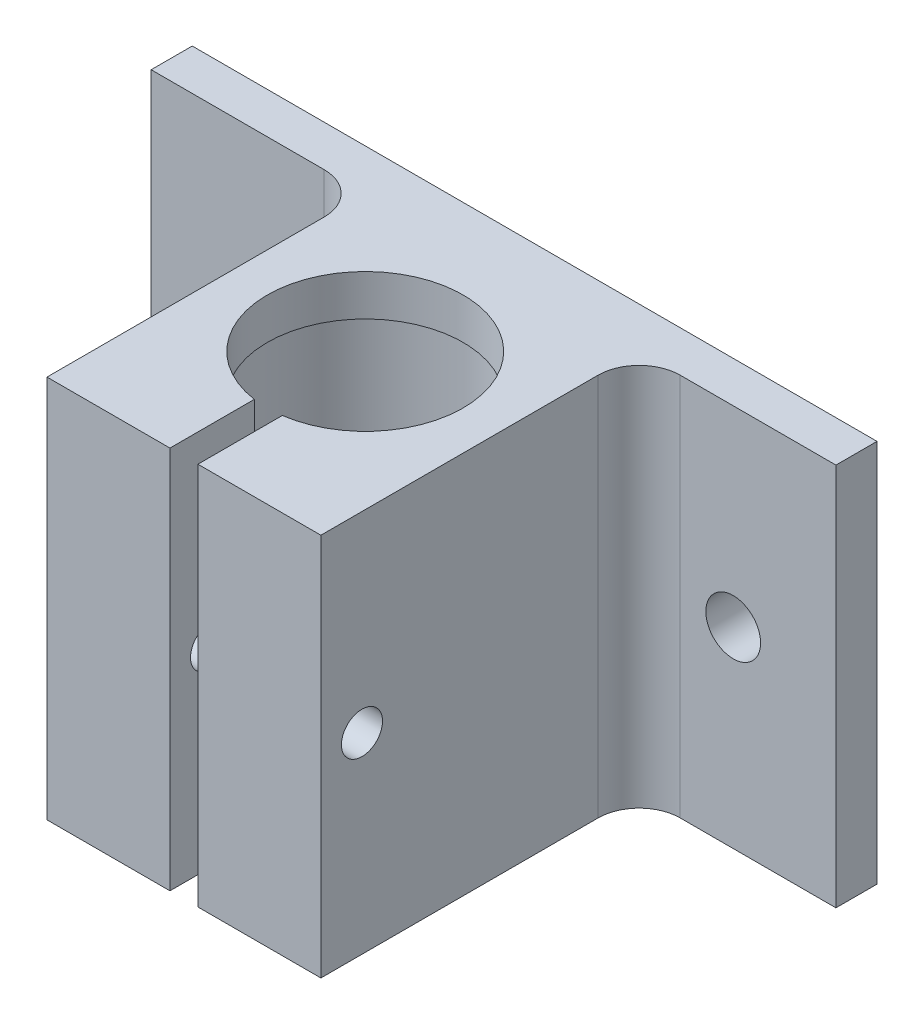
ISO-10303-21;
HEADER;
FILE_DESCRIPTION(('STEP AP214'),'2;1');
FILE_NAME('part.step','',(''),(''),'','','');
FILE_SCHEMA(('AUTOMOTIVE_DESIGN { 1 0 10303 214 1 1 1 1 }'));
ENDSEC;
DATA;
#1=APPLICATION_CONTEXT('core data for automotive mechanical design processes');
#2=APPLICATION_PROTOCOL_DEFINITION('international standard','automotive_design',2000,#1);
#3=PRODUCT_CONTEXT('',#1,'mechanical');
#4=PRODUCT('Part','Part','',(#3));
#5=PRODUCT_RELATED_PRODUCT_CATEGORY('part','',(#4));
#6=PRODUCT_DEFINITION_FORMATION('','',#4);
#7=PRODUCT_DEFINITION_CONTEXT('part definition',#1,'design');
#8=PRODUCT_DEFINITION('design','',#6,#7);
#9=PRODUCT_DEFINITION_SHAPE('','',#8);
#10=(LENGTH_UNIT() NAMED_UNIT(*) SI_UNIT(.MILLI.,.METRE.));
#11=(NAMED_UNIT(*) PLANE_ANGLE_UNIT() SI_UNIT($,.RADIAN.));
#12=(NAMED_UNIT(*) SI_UNIT($,.STERADIAN.) SOLID_ANGLE_UNIT());
#13=UNCERTAINTY_MEASURE_WITH_UNIT(LENGTH_MEASURE(1.E-05),#10,'distance_accuracy_value','');
#14=(GEOMETRIC_REPRESENTATION_CONTEXT(3) GLOBAL_UNCERTAINTY_ASSIGNED_CONTEXT((#13)) GLOBAL_UNIT_ASSIGNED_CONTEXT((#10,
#11,#12)) REPRESENTATION_CONTEXT('',''));
#15=CARTESIAN_POINT('',(0.,0.,0.));
#16=DIRECTION('',(0.,0.,1.));
#17=DIRECTION('',(1.,0.,0.));
#18=AXIS2_PLACEMENT_3D('',#15,#16,#17);
#19=CARTESIAN_POINT('',(0.,28.,0.));
#20=DIRECTION('',(0.,-1.,0.));
#21=DIRECTION('',(0.,0.,-1.));
#22=AXIS2_PLACEMENT_3D('',#19,#20,#21);
#23=CYLINDRICAL_SURFACE('',#22,7.15);
#24=CARTESIAN_POINT('',(0.,25.,0.));
#25=DIRECTION('',(0.,-1.,0.));
#26=DIRECTION('',(0.,0.,-1.));
#27=AXIS2_PLACEMENT_3D('',#24,#25,#26);
#28=CIRCLE('',#27,7.15);
#29=CARTESIAN_POINT('',(1.02142857142857,25.,7.07666472806713));
#30=VERTEX_POINT('',#29);
#31=CARTESIAN_POINT('',(-1.02142857142857,25.,7.07666472806713));
#32=VERTEX_POINT('',#31);
#33=EDGE_CURVE('E711',#30,#32,#28,.F.);
#34=ORIENTED_EDGE('',*,*,#33,.F.);
#35=DIRECTION('',(0.,-1.,0.));
#36=VECTOR('',#35,1.);
#37=CARTESIAN_POINT('',(1.02142857142857,28.,7.07666472806713));
#38=LINE('',#37,#36);
#39=CARTESIAN_POINT('',(1.02142857142857,28.,7.07666472806713));
#40=VERTEX_POINT('',#39);
#41=EDGE_CURVE('E201',#40,#30,#38,.T.);
#42=ORIENTED_EDGE('',*,*,#41,.F.);
#43=CARTESIAN_POINT('',(0.,28.,0.));
#44=DIRECTION('',(0.,-1.,0.));
#45=DIRECTION('',(0.,0.,1.));
#46=AXIS2_PLACEMENT_3D('',#43,#44,#45);
#47=CIRCLE('',#46,7.15);
#48=CARTESIAN_POINT('',(-1.02142857142857,28.,7.07666472806713));
#49=VERTEX_POINT('',#48);
#50=EDGE_CURVE('E333',#49,#40,#47,.T.);
#51=ORIENTED_EDGE('',*,*,#50,.F.);
#52=DIRECTION('',(0.,-1.,0.));
#53=VECTOR('',#52,1.);
#54=CARTESIAN_POINT('',(-1.02142857142857,28.,7.07666472806713));
#55=LINE('',#54,#53);
#56=EDGE_CURVE('E206',#49,#32,#55,.T.);
#57=ORIENTED_EDGE('',*,*,#56,.T.);
#58=EDGE_LOOP('',(#34,#42,#51,#57));
#59=FACE_BOUND('',#58,.T.);
#60=ADVANCED_FACE('F34',(#59),#23,.F.);
#61=CARTESIAN_POINT('',(10.,14.,10.2380490068163));
#62=DIRECTION('',(-1.,0.,0.));
#63=DIRECTION('',(0.,0.,1.));
#64=AXIS2_PLACEMENT_3D('',#61,#62,#63);
#65=CYLINDRICAL_SURFACE('',#64,1.5);
#66=CARTESIAN_POINT('',(-1.02142857142857,14.,10.2380490068163));
#67=DIRECTION('',(-1.,0.,0.));
#68=DIRECTION('',(0.,0.,1.));
#69=AXIS2_PLACEMENT_3D('',#66,#67,#68);
#70=CIRCLE('',#69,1.5);
#71=CARTESIAN_POINT('',(-1.02142857142857,14.,11.7380490068163));
#72=VERTEX_POINT('',#71);
#73=EDGE_CURVE('E315',#72,#72,#70,.T.);
#74=ORIENTED_EDGE('',*,*,#73,.F.);
#75=EDGE_LOOP('',(#74));
#76=FACE_BOUND('',#75,.T.);
#77=CARTESIAN_POINT('',(-8.,14.,10.2380490068163));
#78=DIRECTION('',(-1.,0.,0.));
#79=DIRECTION('',(0.,0.,1.));
#80=AXIS2_PLACEMENT_3D('',#77,#78,#79);
#81=CIRCLE('',#80,1.5);
#82=CARTESIAN_POINT('',(-8.,14.,11.7380490068163));
#83=VERTEX_POINT('',#82);
#84=EDGE_CURVE('E232',#83,#83,#81,.F.);
#85=ORIENTED_EDGE('',*,*,#84,.F.);
#86=EDGE_LOOP('',(#85));
#87=FACE_BOUND('',#86,.T.);
#88=ADVANCED_FACE('F353',(#76,#87),#65,.F.);
#89=CARTESIAN_POINT('',(24.3688826027197,28.,-10.));
#90=DIRECTION('',(-1.,0.,0.));
#91=DIRECTION('',(0.,0.,1.));
#92=AXIS2_PLACEMENT_3D('',#89,#90,#91);
#93=PLANE('',#92);
#94=DIRECTION('',(0.,0.,-1.));
#95=VECTOR('',#94,1.);
#96=CARTESIAN_POINT('',(24.3688826027197,0.,-10.));
#97=LINE('',#96,#95);
#98=CARTESIAN_POINT('',(24.3688826027197,0.,-10.));
#99=VERTEX_POINT('',#98);
#100=CARTESIAN_POINT('',(24.3688826027197,0.,-13.));
#101=VERTEX_POINT('',#100);
#102=EDGE_CURVE('E311',#99,#101,#97,.T.);
#103=ORIENTED_EDGE('',*,*,#102,.T.);
#104=DIRECTION('',(0.,-1.,0.));
#105=VECTOR('',#104,1.);
#106=CARTESIAN_POINT('',(24.3688826027197,28.,-13.));
#107=LINE('',#106,#105);
#108=CARTESIAN_POINT('',(24.3688826027197,28.,-13.));
#109=VERTEX_POINT('',#108);
#110=EDGE_CURVE('E228',#109,#101,#107,.T.);
#111=ORIENTED_EDGE('',*,*,#110,.F.);
#112=DIRECTION('',(0.,0.,-1.));
#113=VECTOR('',#112,1.);
#114=CARTESIAN_POINT('',(24.3688826027197,28.,-10.));
#115=LINE('',#114,#113);
#116=CARTESIAN_POINT('',(24.3688826027197,28.,-10.));
#117=VERTEX_POINT('',#116);
#118=EDGE_CURVE('E278',#117,#109,#115,.T.);
#119=ORIENTED_EDGE('',*,*,#118,.F.);
#120=DIRECTION('',(0.,-1.,0.));
#121=VECTOR('',#120,1.);
#122=CARTESIAN_POINT('',(24.3688826027197,28.,-10.));
#123=LINE('',#122,#121);
#124=EDGE_CURVE('E279',#117,#99,#123,.T.);
#125=ORIENTED_EDGE('',*,*,#124,.T.);
#126=EDGE_LOOP('',(#103,#111,#119,#125));
#127=FACE_BOUND('',#126,.T.);
#128=ADVANCED_FACE('F358',(#127),#93,.F.);
#129=CARTESIAN_POINT('',(-25.6311173972803,28.,-13.));
#130=DIRECTION('',(0.,0.,1.));
#131=DIRECTION('',(1.,0.,0.));
#132=AXIS2_PLACEMENT_3D('',#129,#130,#131);
#133=PLANE('',#132);
#134=CARTESIAN_POINT('',(16.8688826027197,14.,-13.));
#135=DIRECTION('',(0.,0.,-1.));
#136=DIRECTION('',(-1.,0.,0.));
#137=AXIS2_PLACEMENT_3D('',#134,#135,#136);
#138=CIRCLE('',#137,2.);
#139=CARTESIAN_POINT('',(14.8688826027197,14.,-13.));
#140=VERTEX_POINT('',#139);
#141=EDGE_CURVE('E444',#140,#140,#138,.T.);
#142=ORIENTED_EDGE('',*,*,#141,.F.);
#143=EDGE_LOOP('',(#142));
#144=FACE_BOUND('',#143,.T.);
#145=CARTESIAN_POINT('',(-16.8688826027197,14.,-13.));
#146=DIRECTION('',(0.,0.,-1.));
#147=DIRECTION('',(1.,0.,0.));
#148=AXIS2_PLACEMENT_3D('',#145,#146,#147);
#149=CIRCLE('',#148,2.);
#150=CARTESIAN_POINT('',(-14.8688826027197,14.,-13.));
#151=VERTEX_POINT('',#150);
#152=EDGE_CURVE('E456',#151,#151,#149,.T.);
#153=ORIENTED_EDGE('',*,*,#152,.F.);
#154=EDGE_LOOP('',(#153));
#155=FACE_BOUND('',#154,.T.);
#156=DIRECTION('',(-1.,0.,0.));
#157=VECTOR('',#156,1.);
#158=CARTESIAN_POINT('',(-25.6311173972803,0.,-13.));
#159=LINE('',#158,#157);
#160=CARTESIAN_POINT('',(-25.6311173972803,0.,-13.));
#161=VERTEX_POINT('',#160);
#162=EDGE_CURVE('E314',#101,#161,#159,.T.);
#163=ORIENTED_EDGE('',*,*,#162,.T.);
#164=DIRECTION('',(0.,-1.,0.));
#165=VECTOR('',#164,1.);
#166=CARTESIAN_POINT('',(-25.6311173972803,28.,-13.));
#167=LINE('',#166,#165);
#168=CARTESIAN_POINT('',(-25.6311173972803,28.,-13.));
#169=VERTEX_POINT('',#168);
#170=EDGE_CURVE('E225',#169,#161,#167,.T.);
#171=ORIENTED_EDGE('',*,*,#170,.F.);
#172=DIRECTION('',(-1.,0.,0.));
#173=VECTOR('',#172,1.);
#174=CARTESIAN_POINT('',(-25.6311173972803,28.,-13.));
#175=LINE('',#174,#173);
#176=EDGE_CURVE('E511',#109,#169,#175,.T.);
#177=ORIENTED_EDGE('',*,*,#176,.F.);
#178=ORIENTED_EDGE('',*,*,#110,.T.);
#179=EDGE_LOOP('',(#163,#171,#177,#178));
#180=FACE_BOUND('',#179,.T.);
#181=ADVANCED_FACE('F378',(#144,#155,#180),#133,.F.);
#182=CARTESIAN_POINT('',(-25.6311173972803,28.,-10.));
#183=DIRECTION('',(1.,0.,0.));
#184=DIRECTION('',(0.,0.,-1.));
#185=AXIS2_PLACEMENT_3D('',#182,#183,#184);
#186=PLANE('',#185);
#187=DIRECTION('',(0.,0.,1.));
#188=VECTOR('',#187,1.);
#189=CARTESIAN_POINT('',(-25.6311173972803,0.,-10.));
#190=LINE('',#189,#188);
#191=CARTESIAN_POINT('',(-25.6311173972803,0.,-10.));
#192=VERTEX_POINT('',#191);
#193=EDGE_CURVE('E317',#161,#192,#190,.T.);
#194=ORIENTED_EDGE('',*,*,#193,.T.);
#195=DIRECTION('',(0.,-1.,0.));
#196=VECTOR('',#195,1.);
#197=CARTESIAN_POINT('',(-25.6311173972803,28.,-10.));
#198=LINE('',#197,#196);
#199=CARTESIAN_POINT('',(-25.6311173972803,28.,-10.));
#200=VERTEX_POINT('',#199);
#201=EDGE_CURVE('E222',#200,#192,#198,.T.);
#202=ORIENTED_EDGE('',*,*,#201,.F.);
#203=DIRECTION('',(0.,0.,1.));
#204=VECTOR('',#203,1.);
#205=CARTESIAN_POINT('',(-25.6311173972803,28.,-10.));
#206=LINE('',#205,#204);
#207=EDGE_CURVE('E513',#169,#200,#206,.T.);
#208=ORIENTED_EDGE('',*,*,#207,.F.);
#209=ORIENTED_EDGE('',*,*,#170,.T.);
#210=EDGE_LOOP('',(#194,#202,#208,#209));
#211=FACE_BOUND('',#210,.T.);
#212=ADVANCED_FACE('F374',(#211),#186,.F.);
#213=CARTESIAN_POINT('',(-25.6311173972803,28.,-10.));
#214=DIRECTION('',(0.,0.,-1.));
#215=DIRECTION('',(-1.,0.,0.));
#216=AXIS2_PLACEMENT_3D('',#213,#214,#215);
#217=PLANE('',#216);
#218=CARTESIAN_POINT('',(-16.8688826027197,14.,-10.));
#219=DIRECTION('',(0.,0.,-1.));
#220=DIRECTION('',(1.,0.,0.));
#221=AXIS2_PLACEMENT_3D('',#218,#219,#220);
#222=CIRCLE('',#221,2.);
#223=CARTESIAN_POINT('',(-14.8688826027197,14.,-10.));
#224=VERTEX_POINT('',#223);
#225=EDGE_CURVE('E449',#224,#224,#222,.T.);
#226=ORIENTED_EDGE('',*,*,#225,.T.);
#227=EDGE_LOOP('',(#226));
#228=FACE_BOUND('',#227,.T.);
#229=DIRECTION('',(1.,0.,0.));
#230=VECTOR('',#229,1.);
#231=CARTESIAN_POINT('',(-25.6311173972803,0.,-10.));
#232=LINE('',#231,#230);
#233=CARTESIAN_POINT('',(-13.,0.,-10.));
#234=VERTEX_POINT('',#233);
#235=EDGE_CURVE('E319',#192,#234,#232,.T.);
#236=ORIENTED_EDGE('',*,*,#235,.T.);
#237=DIRECTION('',(0.,-1.,0.));
#238=VECTOR('',#237,1.);
#239=CARTESIAN_POINT('',(-13.,28.,-10.));
#240=LINE('',#239,#238);
#241=CARTESIAN_POINT('',(-13.,28.,-10.));
#242=VERTEX_POINT('',#241);
#243=EDGE_CURVE('E57',#234,#242,#240,.F.);
#244=ORIENTED_EDGE('',*,*,#243,.T.);
#245=DIRECTION('',(1.,0.,0.));
#246=VECTOR('',#245,1.);
#247=CARTESIAN_POINT('',(-25.6311173972803,28.,-10.));
#248=LINE('',#247,#246);
#249=EDGE_CURVE('E335',#200,#242,#248,.T.);
#250=ORIENTED_EDGE('',*,*,#249,.F.);
#251=ORIENTED_EDGE('',*,*,#201,.T.);
#252=EDGE_LOOP('',(#236,#244,#250,#251));
#253=FACE_BOUND('',#252,.T.);
#254=ADVANCED_FACE('F370',(#228,#253),#217,.F.);
#255=CARTESIAN_POINT('',(-10.,28.,-10.));
#256=DIRECTION('',(1.,0.,0.));
#257=DIRECTION('',(0.,0.,-1.));
#258=AXIS2_PLACEMENT_3D('',#255,#256,#257);
#259=PLANE('',#258);
#260=DIRECTION('',(0.,-0.500000000000001,-0.866025403784438));
#261=VECTOR('',#260,1.);
#262=CARTESIAN_POINT('',(-10.,17.1754264805429,10.2380490068163));
#263=LINE('',#262,#261);
#264=CARTESIAN_POINT('',(-10.,17.1754264805429,10.2380490068163));
#265=VERTEX_POINT('',#264);
#266=CARTESIAN_POINT('',(-10.,15.5877132402715,7.4880490068163));
#267=VERTEX_POINT('',#266);
#268=EDGE_CURVE('E446',#265,#267,#263,.T.);
#269=ORIENTED_EDGE('',*,*,#268,.F.);
#270=DIRECTION('',(0.,0.5,-0.866025403784439));
#271=VECTOR('',#270,1.);
#272=CARTESIAN_POINT('',(-10.,15.5877132402715,12.9880490068163));
#273=LINE('',#272,#271);
#274=CARTESIAN_POINT('',(-10.,15.5877132402715,12.9880490068163));
#275=VERTEX_POINT('',#274);
#276=EDGE_CURVE('E443',#275,#265,#273,.T.);
#277=ORIENTED_EDGE('',*,*,#276,.F.);
#278=DIRECTION('',(0.,1.,0.));
#279=VECTOR('',#278,1.);
#280=CARTESIAN_POINT('',(-10.,12.4122867597285,12.9880490068163));
#281=LINE('',#280,#279);
#282=CARTESIAN_POINT('',(-10.,12.4122867597285,12.9880490068163));
#283=VERTEX_POINT('',#282);
#284=EDGE_CURVE('E463',#283,#275,#281,.T.);
#285=ORIENTED_EDGE('',*,*,#284,.F.);
#286=DIRECTION('',(0.,0.5,0.866025403784439));
#287=VECTOR('',#286,1.);
#288=CARTESIAN_POINT('',(-10.,10.8245735194571,10.2380490068163));
#289=LINE('',#288,#287);
#290=CARTESIAN_POINT('',(-10.,10.8245735194571,10.2380490068163));
#291=VERTEX_POINT('',#290);
#292=EDGE_CURVE('E487',#291,#283,#289,.T.);
#293=ORIENTED_EDGE('',*,*,#292,.F.);
#294=DIRECTION('',(0.,-0.5,0.866025403784438));
#295=VECTOR('',#294,1.);
#296=CARTESIAN_POINT('',(-10.,12.4122867597285,7.4880490068163));
#297=LINE('',#296,#295);
#298=CARTESIAN_POINT('',(-10.,12.4122867597285,7.4880490068163));
#299=VERTEX_POINT('',#298);
#300=EDGE_CURVE('E484',#299,#291,#297,.T.);
#301=ORIENTED_EDGE('',*,*,#300,.F.);
#302=DIRECTION('',(0.,-1.,0.));
#303=VECTOR('',#302,1.);
#304=CARTESIAN_POINT('',(-10.,15.5877132402715,7.4880490068163));
#305=LINE('',#304,#303);
#306=EDGE_CURVE('E481',#267,#299,#305,.T.);
#307=ORIENTED_EDGE('',*,*,#306,.F.);
#308=EDGE_LOOP('',(#269,#277,#285,#293,#301,#307));
#309=FACE_BOUND('',#308,.T.);
#310=DIRECTION('',(0.,0.,1.));
#311=VECTOR('',#310,1.);
#312=CARTESIAN_POINT('',(-10.,28.,-10.));
#313=LINE('',#312,#311);
#314=CARTESIAN_POINT('',(-10.,28.,-7.));
#315=VERTEX_POINT('',#314);
#316=CARTESIAN_POINT('',(-10.,28.,13.2380490068163));
#317=VERTEX_POINT('',#316);
#318=EDGE_CURVE('E331',#315,#317,#313,.T.);
#319=ORIENTED_EDGE('',*,*,#318,.F.);
#320=DIRECTION('',(0.,-1.,0.));
#321=VECTOR('',#320,1.);
#322=CARTESIAN_POINT('',(-10.,0.,-7.));
#323=LINE('',#322,#321);
#324=CARTESIAN_POINT('',(-10.,0.,-7.));
#325=VERTEX_POINT('',#324);
#326=EDGE_CURVE('E245',#315,#325,#323,.T.);
#327=ORIENTED_EDGE('',*,*,#326,.T.);
#328=DIRECTION('',(0.,0.,1.));
#329=VECTOR('',#328,1.);
#330=CARTESIAN_POINT('',(-10.,0.,-10.));
#331=LINE('',#330,#329);
#332=CARTESIAN_POINT('',(-10.,0.,13.2380490068163));
#333=VERTEX_POINT('',#332);
#334=EDGE_CURVE('E268',#325,#333,#331,.T.);
#335=ORIENTED_EDGE('',*,*,#334,.T.);
#336=DIRECTION('',(0.,-1.,0.));
#337=VECTOR('',#336,1.);
#338=CARTESIAN_POINT('',(-10.,28.,13.2380490068163));
#339=LINE('',#338,#337);
#340=EDGE_CURVE('E219',#317,#333,#339,.T.);
#341=ORIENTED_EDGE('',*,*,#340,.F.);
#342=EDGE_LOOP('',(#319,#327,#335,#341));
#343=FACE_BOUND('',#342,.T.);
#344=ADVANCED_FACE('F324',(#309,#343),#259,.F.);
#345=CARTESIAN_POINT('',(-10.,28.,13.2380490068163));
#346=DIRECTION('',(0.,0.,-1.));
#347=DIRECTION('',(-1.,0.,0.));
#348=AXIS2_PLACEMENT_3D('',#345,#346,#347);
#349=PLANE('',#348);
#350=DIRECTION('',(1.,0.,0.));
#351=VECTOR('',#350,1.);
#352=CARTESIAN_POINT('',(-10.,0.,13.2380490068163));
#353=LINE('',#352,#351);
#354=CARTESIAN_POINT('',(-1.02142857142857,0.,13.2380490068163));
#355=VERTEX_POINT('',#354);
#356=EDGE_CURVE('E264',#333,#355,#353,.T.);
#357=ORIENTED_EDGE('',*,*,#356,.T.);
#358=DIRECTION('',(0.,-1.,0.));
#359=VECTOR('',#358,1.);
#360=CARTESIAN_POINT('',(-1.02142857142857,28.,13.2380490068163));
#361=LINE('',#360,#359);
#362=CARTESIAN_POINT('',(-1.02142857142857,28.,13.2380490068163));
#363=VERTEX_POINT('',#362);
#364=EDGE_CURVE('E210',#363,#355,#361,.T.);
#365=ORIENTED_EDGE('',*,*,#364,.F.);
#366=DIRECTION('',(1.,0.,0.));
#367=VECTOR('',#366,1.);
#368=CARTESIAN_POINT('',(-10.,28.,13.2380490068163));
#369=LINE('',#368,#367);
#370=EDGE_CURVE('E329',#317,#363,#369,.T.);
#371=ORIENTED_EDGE('',*,*,#370,.F.);
#372=ORIENTED_EDGE('',*,*,#340,.T.);
#373=EDGE_LOOP('',(#357,#365,#371,#372));
#374=FACE_BOUND('',#373,.T.);
#375=ADVANCED_FACE('F328',(#374),#349,.F.);
#376=CARTESIAN_POINT('',(-1.02142857142857,28.,13.2380490068163));
#377=DIRECTION('',(-1.,0.,0.));
#378=DIRECTION('',(0.,0.,1.));
#379=AXIS2_PLACEMENT_3D('',#376,#377,#378);
#380=PLANE('',#379);
#381=ORIENTED_EDGE('',*,*,#73,.T.);
#382=EDGE_LOOP('',(#381));
#383=FACE_BOUND('',#382,.T.);
#384=DIRECTION('',(0.,0.,-1.));
#385=VECTOR('',#384,1.);
#386=CARTESIAN_POINT('',(-1.02142857142857,0.,13.2380490068163));
#387=LINE('',#386,#385);
#388=CARTESIAN_POINT('',(-1.02142857142857,0.,7.68239439715701));
#389=VERTEX_POINT('',#388);
#390=EDGE_CURVE('E257',#355,#389,#387,.T.);
#391=ORIENTED_EDGE('',*,*,#390,.T.);
#392=DIRECTION('',(0.,-1.,0.));
#393=VECTOR('',#392,1.);
#394=CARTESIAN_POINT('',(-1.02142857142857,25.,7.68239439715701));
#395=LINE('',#394,#393);
#396=CARTESIAN_POINT('',(-1.02142857142857,25.,7.68239439715701));
#397=VERTEX_POINT('',#396);
#398=EDGE_CURVE('E49',#389,#397,#395,.F.);
#399=ORIENTED_EDGE('',*,*,#398,.T.);
#400=DIRECTION('',(0.,0.,1.));
#401=VECTOR('',#400,1.);
#402=CARTESIAN_POINT('',(-1.02142857142857,25.,13.2380490068163));
#403=LINE('',#402,#401);
#404=EDGE_CURVE('E195',#32,#397,#403,.T.);
#405=ORIENTED_EDGE('',*,*,#404,.F.);
#406=ORIENTED_EDGE('',*,*,#56,.F.);
#407=DIRECTION('',(0.,0.,-1.));
#408=VECTOR('',#407,1.);
#409=CARTESIAN_POINT('',(-1.02142857142857,28.,13.2380490068163));
#410=LINE('',#409,#408);
#411=EDGE_CURVE('E330',#363,#49,#410,.T.);
#412=ORIENTED_EDGE('',*,*,#411,.F.);
#413=ORIENTED_EDGE('',*,*,#364,.T.);
#414=EDGE_LOOP('',(#391,#399,#405,#406,#412,#413));
#415=FACE_BOUND('',#414,.T.);
#416=ADVANCED_FACE('F261',(#383,#415),#380,.F.);
#417=CARTESIAN_POINT('',(1.02142857142857,28.,13.2380490068163));
#418=DIRECTION('',(1.,0.,0.));
#419=DIRECTION('',(0.,0.,-1.));
#420=AXIS2_PLACEMENT_3D('',#417,#418,#419);
#421=PLANE('',#420);
#422=CARTESIAN_POINT('',(1.02142857142857,14.,10.2380490068163));
#423=DIRECTION('',(1.,0.,0.));
#424=DIRECTION('',(0.,0.,-1.));
#425=AXIS2_PLACEMENT_3D('',#422,#423,#424);
#426=CIRCLE('',#425,1.5);
#427=CARTESIAN_POINT('',(1.02142857142857,14.,8.73804900681629));
#428=VERTEX_POINT('',#427);
#429=EDGE_CURVE('E505',#428,#428,#426,.T.);
#430=ORIENTED_EDGE('',*,*,#429,.T.);
#431=EDGE_LOOP('',(#430));
#432=FACE_BOUND('',#431,.T.);
#433=DIRECTION('',(0.,0.,-1.));
#434=VECTOR('',#433,1.);
#435=CARTESIAN_POINT('',(1.02142857142857,25.,13.2380490068163));
#436=LINE('',#435,#434);
#437=CARTESIAN_POINT('',(1.02142857142857,25.,7.68239439715701));
#438=VERTEX_POINT('',#437);
#439=EDGE_CURVE('E11',#438,#30,#436,.T.);
#440=ORIENTED_EDGE('',*,*,#439,.F.);
#441=DIRECTION('',(0.,-1.,0.));
#442=VECTOR('',#441,1.);
#443=CARTESIAN_POINT('',(1.02142857142857,25.,7.68239439715701));
#444=LINE('',#443,#442);
#445=CARTESIAN_POINT('',(1.02142857142857,0.,7.68239439715701));
#446=VERTEX_POINT('',#445);
#447=EDGE_CURVE('E183',#438,#446,#444,.T.);
#448=ORIENTED_EDGE('',*,*,#447,.T.);
#449=DIRECTION('',(0.,0.,1.));
#450=VECTOR('',#449,1.);
#451=CARTESIAN_POINT('',(1.02142857142857,0.,13.2380490068163));
#452=LINE('',#451,#450);
#453=CARTESIAN_POINT('',(1.02142857142857,0.,13.2380490068163));
#454=VERTEX_POINT('',#453);
#455=EDGE_CURVE('E259',#446,#454,#452,.T.);
#456=ORIENTED_EDGE('',*,*,#455,.T.);
#457=DIRECTION('',(0.,-1.,0.));
#458=VECTOR('',#457,1.);
#459=CARTESIAN_POINT('',(1.02142857142857,28.,13.2380490068163));
#460=LINE('',#459,#458);
#461=CARTESIAN_POINT('',(1.02142857142857,28.,13.2380490068163));
#462=VERTEX_POINT('',#461);
#463=EDGE_CURVE('E207',#462,#454,#460,.T.);
#464=ORIENTED_EDGE('',*,*,#463,.F.);
#465=DIRECTION('',(0.,0.,1.));
#466=VECTOR('',#465,1.);
#467=CARTESIAN_POINT('',(1.02142857142857,28.,13.2380490068163));
#468=LINE('',#467,#466);
#469=EDGE_CURVE('E203',#40,#462,#468,.T.);
#470=ORIENTED_EDGE('',*,*,#469,.F.);
#471=ORIENTED_EDGE('',*,*,#41,.T.);
#472=EDGE_LOOP('',(#440,#448,#456,#464,#470,#471));
#473=FACE_BOUND('',#472,.T.);
#474=ADVANCED_FACE('F198',(#432,#473),#421,.F.);
#475=CARTESIAN_POINT('',(1.02142857142857,28.,13.2380490068163));
#476=DIRECTION('',(0.,0.,-1.));
#477=DIRECTION('',(-1.,0.,0.));
#478=AXIS2_PLACEMENT_3D('',#475,#476,#477);
#479=PLANE('',#478);
#480=DIRECTION('',(1.,0.,0.));
#481=VECTOR('',#480,1.);
#482=CARTESIAN_POINT('',(1.02142857142857,0.,13.2380490068163));
#483=LINE('',#482,#481);
#484=CARTESIAN_POINT('',(10.,0.,13.2380490068163));
#485=VERTEX_POINT('',#484);
#486=EDGE_CURVE('E266',#454,#485,#483,.T.);
#487=ORIENTED_EDGE('',*,*,#486,.T.);
#488=DIRECTION('',(0.,-1.,0.));
#489=VECTOR('',#488,1.);
#490=CARTESIAN_POINT('',(10.,28.,13.2380490068163));
#491=LINE('',#490,#489);
#492=CARTESIAN_POINT('',(10.,28.,13.2380490068163));
#493=VERTEX_POINT('',#492);
#494=EDGE_CURVE('E213',#493,#485,#491,.T.);
#495=ORIENTED_EDGE('',*,*,#494,.F.);
#496=DIRECTION('',(1.,0.,0.));
#497=VECTOR('',#496,1.);
#498=CARTESIAN_POINT('',(1.02142857142857,28.,13.2380490068163));
#499=LINE('',#498,#497);
#500=EDGE_CURVE('E307',#462,#493,#499,.T.);
#501=ORIENTED_EDGE('',*,*,#500,.F.);
#502=ORIENTED_EDGE('',*,*,#463,.T.);
#503=EDGE_LOOP('',(#487,#495,#501,#502));
#504=FACE_BOUND('',#503,.T.);
#505=ADVANCED_FACE('F341',(#504),#479,.F.);
#506=CARTESIAN_POINT('',(10.,28.,-10.));
#507=DIRECTION('',(-1.,0.,0.));
#508=DIRECTION('',(0.,0.,1.));
#509=AXIS2_PLACEMENT_3D('',#506,#507,#508);
#510=PLANE('',#509);
#511=CARTESIAN_POINT('',(10.,14.,10.2380490068163));
#512=DIRECTION('',(-1.,0.,0.));
#513=DIRECTION('',(0.,0.,1.));
#514=AXIS2_PLACEMENT_3D('',#511,#512,#513);
#515=CIRCLE('',#514,1.5);
#516=CARTESIAN_POINT('',(10.,14.,11.7380490068163));
#517=VERTEX_POINT('',#516);
#518=EDGE_CURVE('E235',#517,#517,#515,.T.);
#519=ORIENTED_EDGE('',*,*,#518,.T.);
#520=EDGE_LOOP('',(#519));
#521=FACE_BOUND('',#520,.T.);
#522=DIRECTION('',(0.,0.,-1.));
#523=VECTOR('',#522,1.);
#524=CARTESIAN_POINT('',(10.,0.,-10.));
#525=LINE('',#524,#523);
#526=CARTESIAN_POINT('',(10.,0.,-7.));
#527=VERTEX_POINT('',#526);
#528=EDGE_CURVE('E273',#485,#527,#525,.T.);
#529=ORIENTED_EDGE('',*,*,#528,.T.);
#530=DIRECTION('',(0.,-1.,0.));
#531=VECTOR('',#530,1.);
#532=CARTESIAN_POINT('',(10.,28.,-7.));
#533=LINE('',#532,#531);
#534=CARTESIAN_POINT('',(10.,28.,-7.));
#535=VERTEX_POINT('',#534);
#536=EDGE_CURVE('E239',#527,#535,#533,.F.);
#537=ORIENTED_EDGE('',*,*,#536,.T.);
#538=DIRECTION('',(0.,0.,-1.));
#539=VECTOR('',#538,1.);
#540=CARTESIAN_POINT('',(10.,28.,-10.));
#541=LINE('',#540,#539);
#542=EDGE_CURVE('E290',#493,#535,#541,.T.);
#543=ORIENTED_EDGE('',*,*,#542,.F.);
#544=ORIENTED_EDGE('',*,*,#494,.T.);
#545=EDGE_LOOP('',(#529,#537,#543,#544));
#546=FACE_BOUND('',#545,.T.);
#547=ADVANCED_FACE('F287',(#521,#546),#510,.F.);
#548=CARTESIAN_POINT('',(10.,28.,-10.));
#549=DIRECTION('',(0.,0.,-1.));
#550=DIRECTION('',(-1.,0.,0.));
#551=AXIS2_PLACEMENT_3D('',#548,#549,#550);
#552=PLANE('',#551);
#553=CARTESIAN_POINT('',(16.8688826027197,14.,-10.));
#554=DIRECTION('',(0.,0.,-1.));
#555=DIRECTION('',(-1.,0.,0.));
#556=AXIS2_PLACEMENT_3D('',#553,#554,#555);
#557=CIRCLE('',#556,2.);
#558=CARTESIAN_POINT('',(14.8688826027197,14.,-10.));
#559=VERTEX_POINT('',#558);
#560=EDGE_CURVE('E442',#559,#559,#557,.T.);
#561=ORIENTED_EDGE('',*,*,#560,.T.);
#562=EDGE_LOOP('',(#561));
#563=FACE_BOUND('',#562,.T.);
#564=DIRECTION('',(1.,0.,0.));
#565=VECTOR('',#564,1.);
#566=CARTESIAN_POINT('',(10.,28.,-10.));
#567=LINE('',#566,#565);
#568=CARTESIAN_POINT('',(13.,28.,-10.));
#569=VERTEX_POINT('',#568);
#570=EDGE_CURVE('E281',#569,#117,#567,.T.);
#571=ORIENTED_EDGE('',*,*,#570,.F.);
#572=DIRECTION('',(0.,-1.,0.));
#573=VECTOR('',#572,1.);
#574=CARTESIAN_POINT('',(13.,0.,-10.));
#575=LINE('',#574,#573);
#576=CARTESIAN_POINT('',(13.,0.,-10.));
#577=VERTEX_POINT('',#576);
#578=EDGE_CURVE('E231',#569,#577,#575,.T.);
#579=ORIENTED_EDGE('',*,*,#578,.T.);
#580=DIRECTION('',(1.,0.,0.));
#581=VECTOR('',#580,1.);
#582=CARTESIAN_POINT('',(10.,0.,-10.));
#583=LINE('',#582,#581);
#584=EDGE_CURVE('E276',#577,#99,#583,.T.);
#585=ORIENTED_EDGE('',*,*,#584,.T.);
#586=ORIENTED_EDGE('',*,*,#124,.F.);
#587=EDGE_LOOP('',(#571,#579,#585,#586));
#588=FACE_BOUND('',#587,.T.);
#589=ADVANCED_FACE('F301',(#563,#588),#552,.F.);
#590=CARTESIAN_POINT('',(0.,28.,0.));
#591=DIRECTION('',(0.,1.,0.));
#592=DIRECTION('',(0.,0.,1.));
#593=AXIS2_PLACEMENT_3D('',#590,#591,#592);
#594=PLANE('',#593);
#595=ORIENTED_EDGE('',*,*,#118,.T.);
#596=ORIENTED_EDGE('',*,*,#176,.T.);
#597=ORIENTED_EDGE('',*,*,#207,.T.);
#598=ORIENTED_EDGE('',*,*,#249,.T.);
#599=CARTESIAN_POINT('',(-13.,28.,-7.));
#600=DIRECTION('',(0.,1.,0.));
#601=DIRECTION('',(0.,0.,1.));
#602=AXIS2_PLACEMENT_3D('',#599,#600,#601);
#603=CIRCLE('',#602,3.);
#604=EDGE_CURVE('E251',#242,#315,#603,.F.);
#605=ORIENTED_EDGE('',*,*,#604,.T.);
#606=ORIENTED_EDGE('',*,*,#318,.T.);
#607=ORIENTED_EDGE('',*,*,#370,.T.);
#608=ORIENTED_EDGE('',*,*,#411,.T.);
#609=ORIENTED_EDGE('',*,*,#50,.T.);
#610=ORIENTED_EDGE('',*,*,#469,.T.);
#611=ORIENTED_EDGE('',*,*,#500,.T.);
#612=ORIENTED_EDGE('',*,*,#542,.T.);
#613=CARTESIAN_POINT('',(13.,28.,-7.));
#614=DIRECTION('',(0.,1.,0.));
#615=DIRECTION('',(0.,0.,1.));
#616=AXIS2_PLACEMENT_3D('',#613,#614,#615);
#617=CIRCLE('',#616,3.);
#618=EDGE_CURVE('E243',#535,#569,#617,.F.);
#619=ORIENTED_EDGE('',*,*,#618,.T.);
#620=ORIENTED_EDGE('',*,*,#570,.T.);
#621=EDGE_LOOP('',(#595,#596,#597,#598,#605,#606,#607,#608,#609,#610,#611,#612,#619,#620));
#622=FACE_BOUND('',#621,.T.);
#623=ADVANCED_FACE('F340',(#622),#594,.T.);
#624=CARTESIAN_POINT('',(0.,0.,0.));
#625=DIRECTION('',(0.,1.,0.));
#626=DIRECTION('',(0.,0.,1.));
#627=AXIS2_PLACEMENT_3D('',#624,#625,#626);
#628=PLANE('',#627);
#629=ORIENTED_EDGE('',*,*,#455,.F.);
#630=CARTESIAN_POINT('',(0.,0.,0.));
#631=DIRECTION('',(0.,1.,0.));
#632=DIRECTION('',(0.,0.,1.));
#633=AXIS2_PLACEMENT_3D('',#630,#631,#632);
#634=CIRCLE('',#633,7.75);
#635=EDGE_CURVE('E42',#446,#389,#634,.T.);
#636=ORIENTED_EDGE('',*,*,#635,.T.);
#637=ORIENTED_EDGE('',*,*,#390,.F.);
#638=ORIENTED_EDGE('',*,*,#356,.F.);
#639=ORIENTED_EDGE('',*,*,#334,.F.);
#640=CARTESIAN_POINT('',(-13.,0.,-7.));
#641=DIRECTION('',(0.,1.,0.));
#642=DIRECTION('',(0.,0.,1.));
#643=AXIS2_PLACEMENT_3D('',#640,#641,#642);
#644=CIRCLE('',#643,3.);
#645=EDGE_CURVE('E249',#325,#234,#644,.T.);
#646=ORIENTED_EDGE('',*,*,#645,.T.);
#647=ORIENTED_EDGE('',*,*,#235,.F.);
#648=ORIENTED_EDGE('',*,*,#193,.F.);
#649=ORIENTED_EDGE('',*,*,#162,.F.);
#650=ORIENTED_EDGE('',*,*,#102,.F.);
#651=ORIENTED_EDGE('',*,*,#584,.F.);
#652=CARTESIAN_POINT('',(13.,0.,-7.));
#653=DIRECTION('',(0.,1.,0.));
#654=DIRECTION('',(0.,0.,1.));
#655=AXIS2_PLACEMENT_3D('',#652,#653,#654);
#656=CIRCLE('',#655,3.);
#657=EDGE_CURVE('E241',#577,#527,#656,.T.);
#658=ORIENTED_EDGE('',*,*,#657,.T.);
#659=ORIENTED_EDGE('',*,*,#528,.F.);
#660=ORIENTED_EDGE('',*,*,#486,.F.);
#661=EDGE_LOOP('',(#629,#636,#637,#638,#639,#646,#647,#648,#649,#650,#651,#658,#659,#660));
#662=FACE_BOUND('',#661,.T.);
#663=ADVANCED_FACE('F255',(#662),#628,.F.);
#664=ORIENTED_EDGE('',*,*,#518,.F.);
#665=EDGE_LOOP('',(#664));
#666=FACE_BOUND('',#665,.T.);
#667=ORIENTED_EDGE('',*,*,#429,.F.);
#668=EDGE_LOOP('',(#667));
#669=FACE_BOUND('',#668,.T.);
#670=ADVANCED_FACE('F361',(#666,#669),#65,.F.);
#671=CARTESIAN_POINT('',(-8.,0.,0.));
#672=DIRECTION('',(-1.,0.,0.));
#673=DIRECTION('',(0.,0.,1.));
#674=AXIS2_PLACEMENT_3D('',#671,#672,#673);
#675=PLANE('',#674);
#676=DIRECTION('',(0.,0.5,-0.866025403784439));
#677=VECTOR('',#676,1.);
#678=CARTESIAN_POINT('',(-8.,15.5877132402715,12.9880490068163));
#679=LINE('',#678,#677);
#680=CARTESIAN_POINT('',(-8.,15.5877132402715,12.9880490068163));
#681=VERTEX_POINT('',#680);
#682=CARTESIAN_POINT('',(-8.,17.1754264805429,10.2380490068163));
#683=VERTEX_POINT('',#682);
#684=EDGE_CURVE('E459',#681,#683,#679,.T.);
#685=ORIENTED_EDGE('',*,*,#684,.T.);
#686=DIRECTION('',(0.,-0.500000000000001,-0.866025403784438));
#687=VECTOR('',#686,1.);
#688=CARTESIAN_POINT('',(-8.,17.1754264805429,10.2380490068163));
#689=LINE('',#688,#687);
#690=CARTESIAN_POINT('',(-8.,15.5877132402715,7.4880490068163));
#691=VERTEX_POINT('',#690);
#692=EDGE_CURVE('E462',#683,#691,#689,.T.);
#693=ORIENTED_EDGE('',*,*,#692,.T.);
#694=DIRECTION('',(0.,-1.,0.));
#695=VECTOR('',#694,1.);
#696=CARTESIAN_POINT('',(-8.,15.5877132402715,7.4880490068163));
#697=LINE('',#696,#695);
#698=CARTESIAN_POINT('',(-8.,12.4122867597285,7.4880490068163));
#699=VERTEX_POINT('',#698);
#700=EDGE_CURVE('E466',#691,#699,#697,.T.);
#701=ORIENTED_EDGE('',*,*,#700,.T.);
#702=DIRECTION('',(0.,-0.5,0.866025403784438));
#703=VECTOR('',#702,1.);
#704=CARTESIAN_POINT('',(-8.,12.4122867597285,7.4880490068163));
#705=LINE('',#704,#703);
#706=CARTESIAN_POINT('',(-8.,10.8245735194571,10.2380490068163));
#707=VERTEX_POINT('',#706);
#708=EDGE_CURVE('E469',#699,#707,#705,.T.);
#709=ORIENTED_EDGE('',*,*,#708,.T.);
#710=DIRECTION('',(0.,0.5,0.866025403784439));
#711=VECTOR('',#710,1.);
#712=CARTESIAN_POINT('',(-8.,10.8245735194571,10.2380490068163));
#713=LINE('',#712,#711);
#714=CARTESIAN_POINT('',(-8.,12.4122867597285,12.9880490068163));
#715=VERTEX_POINT('',#714);
#716=EDGE_CURVE('E472',#707,#715,#713,.T.);
#717=ORIENTED_EDGE('',*,*,#716,.T.);
#718=DIRECTION('',(0.,1.,0.));
#719=VECTOR('',#718,1.);
#720=CARTESIAN_POINT('',(-8.,12.4122867597285,12.9880490068163));
#721=LINE('',#720,#719);
#722=EDGE_CURVE('E475',#715,#681,#721,.T.);
#723=ORIENTED_EDGE('',*,*,#722,.T.);
#724=EDGE_LOOP('',(#685,#693,#701,#709,#717,#723));
#725=FACE_BOUND('',#724,.T.);
#726=ORIENTED_EDGE('',*,*,#84,.T.);
#727=EDGE_LOOP('',(#726));
#728=FACE_BOUND('',#727,.T.);
#729=ADVANCED_FACE('F405',(#725,#728),#675,.T.);
#730=CARTESIAN_POINT('',(-8.,15.5877132402715,12.9880490068163));
#731=DIRECTION('',(0.,0.866025403784439,0.5));
#732=DIRECTION('',(0.,-0.5,0.866025403784439));
#733=AXIS2_PLACEMENT_3D('',#730,#731,#732);
#734=PLANE('',#733);
#735=ORIENTED_EDGE('',*,*,#276,.T.);
#736=DIRECTION('',(-1.,0.,0.));
#737=VECTOR('',#736,1.);
#738=CARTESIAN_POINT('',(-8.,17.1754264805429,10.2380490068163));
#739=LINE('',#738,#737);
#740=EDGE_CURVE('E477',#683,#265,#739,.T.);
#741=ORIENTED_EDGE('',*,*,#740,.F.);
#742=ORIENTED_EDGE('',*,*,#684,.F.);
#743=DIRECTION('',(-1.,0.,0.));
#744=VECTOR('',#743,1.);
#745=CARTESIAN_POINT('',(-8.,15.5877132402715,12.9880490068163));
#746=LINE('',#745,#744);
#747=EDGE_CURVE('E236',#681,#275,#746,.T.);
#748=ORIENTED_EDGE('',*,*,#747,.T.);
#749=EDGE_LOOP('',(#735,#741,#742,#748));
#750=FACE_BOUND('',#749,.T.);
#751=ADVANCED_FACE('F408',(#750),#734,.F.);
#752=CARTESIAN_POINT('',(-8.,12.4122867597285,12.9880490068163));
#753=DIRECTION('',(0.,0.,1.));
#754=DIRECTION('',(1.,0.,0.));
#755=AXIS2_PLACEMENT_3D('',#752,#753,#754);
#756=PLANE('',#755);
#757=ORIENTED_EDGE('',*,*,#284,.T.);
#758=ORIENTED_EDGE('',*,*,#747,.F.);
#759=ORIENTED_EDGE('',*,*,#722,.F.);
#760=DIRECTION('',(-1.,0.,0.));
#761=VECTOR('',#760,1.);
#762=CARTESIAN_POINT('',(-8.,12.4122867597285,12.9880490068163));
#763=LINE('',#762,#761);
#764=EDGE_CURVE('E493',#715,#283,#763,.T.);
#765=ORIENTED_EDGE('',*,*,#764,.T.);
#766=EDGE_LOOP('',(#757,#758,#759,#765));
#767=FACE_BOUND('',#766,.T.);
#768=ADVANCED_FACE('F410',(#767),#756,.F.);
#769=CARTESIAN_POINT('',(-8.,10.8245735194571,10.2380490068163));
#770=DIRECTION('',(0.,-0.866025403784439,0.5));
#771=DIRECTION('',(0.,-0.5,-0.866025403784439));
#772=AXIS2_PLACEMENT_3D('',#769,#770,#771);
#773=PLANE('',#772);
#774=ORIENTED_EDGE('',*,*,#292,.T.);
#775=ORIENTED_EDGE('',*,*,#764,.F.);
#776=ORIENTED_EDGE('',*,*,#716,.F.);
#777=DIRECTION('',(-1.,0.,0.));
#778=VECTOR('',#777,1.);
#779=CARTESIAN_POINT('',(-8.,10.8245735194571,10.2380490068163));
#780=LINE('',#779,#778);
#781=EDGE_CURVE('E495',#707,#291,#780,.T.);
#782=ORIENTED_EDGE('',*,*,#781,.T.);
#783=EDGE_LOOP('',(#774,#775,#776,#782));
#784=FACE_BOUND('',#783,.T.);
#785=ADVANCED_FACE('F413',(#784),#773,.F.);
#786=CARTESIAN_POINT('',(-8.,12.4122867597285,7.4880490068163));
#787=DIRECTION('',(0.,-0.866025403784438,-0.5));
#788=DIRECTION('',(0.,0.5,-0.866025403784438));
#789=AXIS2_PLACEMENT_3D('',#786,#787,#788);
#790=PLANE('',#789);
#791=ORIENTED_EDGE('',*,*,#300,.T.);
#792=ORIENTED_EDGE('',*,*,#781,.F.);
#793=ORIENTED_EDGE('',*,*,#708,.F.);
#794=DIRECTION('',(-1.,0.,0.));
#795=VECTOR('',#794,1.);
#796=CARTESIAN_POINT('',(-8.,12.4122867597285,7.4880490068163));
#797=LINE('',#796,#795);
#798=EDGE_CURVE('E497',#699,#299,#797,.T.);
#799=ORIENTED_EDGE('',*,*,#798,.T.);
#800=EDGE_LOOP('',(#791,#792,#793,#799));
#801=FACE_BOUND('',#800,.T.);
#802=ADVANCED_FACE('F417',(#801),#790,.F.);
#803=CARTESIAN_POINT('',(-8.,15.5877132402715,7.4880490068163));
#804=DIRECTION('',(0.,0.,-1.));
#805=DIRECTION('',(-1.,0.,0.));
#806=AXIS2_PLACEMENT_3D('',#803,#804,#805);
#807=PLANE('',#806);
#808=ORIENTED_EDGE('',*,*,#306,.T.);
#809=ORIENTED_EDGE('',*,*,#798,.F.);
#810=ORIENTED_EDGE('',*,*,#700,.F.);
#811=DIRECTION('',(-1.,0.,0.));
#812=VECTOR('',#811,1.);
#813=CARTESIAN_POINT('',(-8.,15.5877132402715,7.4880490068163));
#814=LINE('',#813,#812);
#815=EDGE_CURVE('E499',#691,#267,#814,.T.);
#816=ORIENTED_EDGE('',*,*,#815,.T.);
#817=EDGE_LOOP('',(#808,#809,#810,#816));
#818=FACE_BOUND('',#817,.T.);
#819=ADVANCED_FACE('F421',(#818),#807,.F.);
#820=CARTESIAN_POINT('',(-8.,17.1754264805429,10.2380490068163));
#821=DIRECTION('',(0.,0.866025403784438,-0.500000000000001));
#822=DIRECTION('',(0.,0.500000000000001,0.866025403784438));
#823=AXIS2_PLACEMENT_3D('',#820,#821,#822);
#824=PLANE('',#823);
#825=ORIENTED_EDGE('',*,*,#268,.T.);
#826=ORIENTED_EDGE('',*,*,#815,.F.);
#827=ORIENTED_EDGE('',*,*,#692,.F.);
#828=ORIENTED_EDGE('',*,*,#740,.T.);
#829=EDGE_LOOP('',(#825,#826,#827,#828));
#830=FACE_BOUND('',#829,.T.);
#831=ADVANCED_FACE('F398',(#830),#824,.F.);
#832=CARTESIAN_POINT('',(16.8688826027197,14.,-10.));
#833=DIRECTION('',(0.,0.,-1.));
#834=DIRECTION('',(-1.,0.,0.));
#835=AXIS2_PLACEMENT_3D('',#832,#833,#834);
#836=CYLINDRICAL_SURFACE('',#835,2.);
#837=ORIENTED_EDGE('',*,*,#560,.F.);
#838=EDGE_LOOP('',(#837));
#839=FACE_BOUND('',#838,.T.);
#840=ORIENTED_EDGE('',*,*,#141,.T.);
#841=EDGE_LOOP('',(#840));
#842=FACE_BOUND('',#841,.T.);
#843=ADVANCED_FACE('F392',(#839,#842),#836,.F.);
#844=CARTESIAN_POINT('',(-16.8688826027197,14.,-10.));
#845=DIRECTION('',(0.,0.,-1.));
#846=DIRECTION('',(-1.,0.,0.));
#847=AXIS2_PLACEMENT_3D('',#844,#845,#846);
#848=CYLINDRICAL_SURFACE('',#847,2.);
#849=ORIENTED_EDGE('',*,*,#225,.F.);
#850=EDGE_LOOP('',(#849));
#851=FACE_BOUND('',#850,.T.);
#852=ORIENTED_EDGE('',*,*,#152,.T.);
#853=EDGE_LOOP('',(#852));
#854=FACE_BOUND('',#853,.T.);
#855=ADVANCED_FACE('F386',(#851,#854),#848,.F.);
#856=CARTESIAN_POINT('',(13.,28.,-7.));
#857=DIRECTION('',(0.,1.,0.));
#858=DIRECTION('',(0.,0.,1.));
#859=AXIS2_PLACEMENT_3D('',#856,#857,#858);
#860=CYLINDRICAL_SURFACE('',#859,3.);
#861=ORIENTED_EDGE('',*,*,#618,.F.);
#862=ORIENTED_EDGE('',*,*,#536,.F.);
#863=ORIENTED_EDGE('',*,*,#657,.F.);
#864=ORIENTED_EDGE('',*,*,#578,.F.);
#865=EDGE_LOOP('',(#861,#862,#863,#864));
#866=FACE_BOUND('',#865,.T.);
#867=ADVANCED_FACE('F298',(#866),#860,.F.);
#868=CARTESIAN_POINT('',(-13.,28.,-7.));
#869=DIRECTION('',(0.,1.,0.));
#870=DIRECTION('',(0.,0.,1.));
#871=AXIS2_PLACEMENT_3D('',#868,#869,#870);
#872=CYLINDRICAL_SURFACE('',#871,3.);
#873=ORIENTED_EDGE('',*,*,#604,.F.);
#874=ORIENTED_EDGE('',*,*,#243,.F.);
#875=ORIENTED_EDGE('',*,*,#645,.F.);
#876=ORIENTED_EDGE('',*,*,#326,.F.);
#877=EDGE_LOOP('',(#873,#874,#875,#876));
#878=FACE_BOUND('',#877,.T.);
#879=ADVANCED_FACE('F36',(#878),#872,.F.);
#880=CARTESIAN_POINT('',(0.,25.,0.));
#881=DIRECTION('',(0.,-1.,0.));
#882=DIRECTION('',(0.,0.,-1.));
#883=AXIS2_PLACEMENT_3D('',#880,#881,#882);
#884=PLANE('',#883);
#885=ORIENTED_EDGE('',*,*,#404,.T.);
#886=CARTESIAN_POINT('',(0.,25.,0.));
#887=DIRECTION('',(0.,-1.,0.));
#888=DIRECTION('',(0.,0.,-1.));
#889=AXIS2_PLACEMENT_3D('',#886,#887,#888);
#890=CIRCLE('',#889,7.75);
#891=EDGE_CURVE('E186',#397,#438,#890,.T.);
#892=ORIENTED_EDGE('',*,*,#891,.T.);
#893=ORIENTED_EDGE('',*,*,#439,.T.);
#894=ORIENTED_EDGE('',*,*,#33,.T.);
#895=EDGE_LOOP('',(#885,#892,#893,#894));
#896=FACE_BOUND('',#895,.T.);
#897=ADVANCED_FACE('F192',(#896),#884,.T.);
#898=CARTESIAN_POINT('',(0.,25.,0.));
#899=DIRECTION('',(0.,-1.,0.));
#900=DIRECTION('',(0.,0.,-1.));
#901=AXIS2_PLACEMENT_3D('',#898,#899,#900);
#902=CYLINDRICAL_SURFACE('',#901,7.75);
#903=ORIENTED_EDGE('',*,*,#635,.F.);
#904=ORIENTED_EDGE('',*,*,#447,.F.);
#905=ORIENTED_EDGE('',*,*,#891,.F.);
#906=ORIENTED_EDGE('',*,*,#398,.F.);
#907=EDGE_LOOP('',(#903,#904,#905,#906));
#908=FACE_BOUND('',#907,.T.);
#909=ADVANCED_FACE('F185',(#908),#902,.F.);
#910=CLOSED_SHELL('',(#60,#88,#128,#181,#212,#254,#344,#375,#416,#474,#505,#547,#589,#623,#663,
#670,#729,#751,#768,#785,#802,#819,#831,#843,#855,#867,#879,#897,#909));
#911=MANIFOLD_SOLID_BREP('B2',#910);
#912=ADVANCED_BREP_SHAPE_REPRESENTATION('',(#18,#911),#14);
#913=SHAPE_DEFINITION_REPRESENTATION(#9,#912);
ENDSEC;
END-ISO-10303-21;
